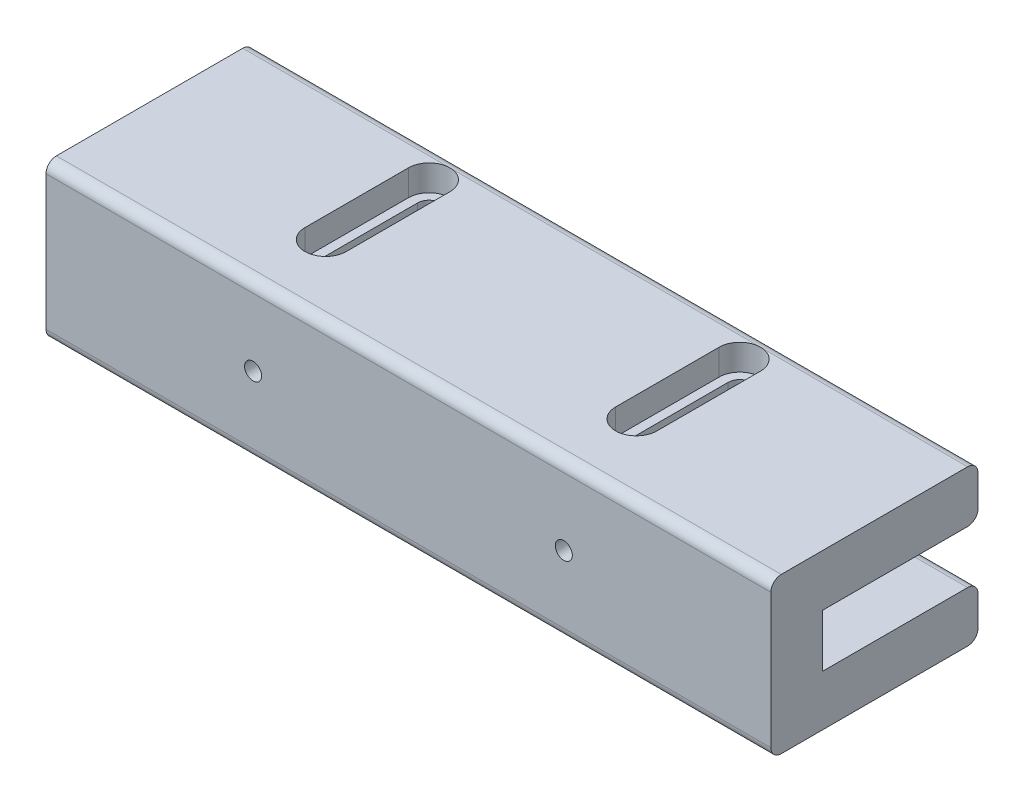
ISO-10303-21;
HEADER;
FILE_DESCRIPTION(('STEP AP214'),'2;1');
FILE_NAME('part.step','',(''),(''),'','','');
FILE_SCHEMA(('AUTOMOTIVE_DESIGN { 1 0 10303 214 1 1 1 1 }'));
ENDSEC;
DATA;
#1=APPLICATION_CONTEXT('core data for automotive mechanical design processes');
#2=APPLICATION_PROTOCOL_DEFINITION('international standard','automotive_design',2000,#1);
#3=PRODUCT_CONTEXT('',#1,'mechanical');
#4=PRODUCT('Part','Part','',(#3));
#5=PRODUCT_RELATED_PRODUCT_CATEGORY('part','',(#4));
#6=PRODUCT_DEFINITION_FORMATION('','',#4);
#7=PRODUCT_DEFINITION_CONTEXT('part definition',#1,'design');
#8=PRODUCT_DEFINITION('design','',#6,#7);
#9=PRODUCT_DEFINITION_SHAPE('','',#8);
#10=(LENGTH_UNIT() NAMED_UNIT(*) SI_UNIT(.MILLI.,.METRE.));
#11=(NAMED_UNIT(*) PLANE_ANGLE_UNIT() SI_UNIT($,.RADIAN.));
#12=(NAMED_UNIT(*) SI_UNIT($,.STERADIAN.) SOLID_ANGLE_UNIT());
#13=UNCERTAINTY_MEASURE_WITH_UNIT(LENGTH_MEASURE(1.E-05),#10,'distance_accuracy_value','');
#14=(GEOMETRIC_REPRESENTATION_CONTEXT(3) GLOBAL_UNCERTAINTY_ASSIGNED_CONTEXT((#13)) GLOBAL_UNIT_ASSIGNED_CONTEXT((#10,
#11,#12)) REPRESENTATION_CONTEXT('',''));
#15=CARTESIAN_POINT('',(0.,0.,0.));
#16=DIRECTION('',(0.,0.,1.));
#17=DIRECTION('',(1.,0.,0.));
#18=AXIS2_PLACEMENT_3D('',#15,#16,#17);
#19=CARTESIAN_POINT('',(27.75,-15.001,5.99999999999999));
#20=DIRECTION('',(-1.,0.,0.));
#21=DIRECTION('',(0.,0.,1.));
#22=AXIS2_PLACEMENT_3D('',#19,#20,#21);
#23=PLANE('',#22);
#24=DIRECTION('',(0.,0.,-1.));
#25=VECTOR('',#24,1.);
#26=CARTESIAN_POINT('',(27.75,10.,6.));
#27=LINE('',#26,#25);
#28=CARTESIAN_POINT('',(27.75,9.99999999999999,26.));
#29=VERTEX_POINT('',#28);
#30=CARTESIAN_POINT('',(27.75,9.99999999999999,6.));
#31=VERTEX_POINT('',#30);
#32=EDGE_CURVE('E68',#29,#31,#27,.T.);
#33=ORIENTED_EDGE('',*,*,#32,.F.);
#34=DIRECTION('',(0.,1.,0.));
#35=VECTOR('',#34,1.);
#36=CARTESIAN_POINT('',(27.75,-15.001,26.));
#37=LINE('',#36,#35);
#38=CARTESIAN_POINT('',(27.75,4.99999999999999,26.));
#39=VERTEX_POINT('',#38);
#40=EDGE_CURVE('E345',#39,#29,#37,.T.);
#41=ORIENTED_EDGE('',*,*,#40,.F.);
#42=DIRECTION('',(0.,0.,-1.));
#43=VECTOR('',#42,1.);
#44=CARTESIAN_POINT('',(27.75,5.,6.));
#45=LINE('',#44,#43);
#46=CARTESIAN_POINT('',(27.75,5.,5.99999999999999));
#47=VERTEX_POINT('',#46);
#48=EDGE_CURVE('E334',#39,#47,#45,.T.);
#49=ORIENTED_EDGE('',*,*,#48,.T.);
#50=DIRECTION('',(0.,1.,0.));
#51=VECTOR('',#50,1.);
#52=CARTESIAN_POINT('',(27.75,-15.001,5.99999999999999));
#53=LINE('',#52,#51);
#54=EDGE_CURVE('E349',#47,#31,#53,.T.);
#55=ORIENTED_EDGE('',*,*,#54,.T.);
#56=EDGE_LOOP('',(#33,#41,#49,#55));
#57=FACE_BOUND('',#56,.T.);
#58=ADVANCED_FACE('F46',(#57),#23,.F.);
#59=CARTESIAN_POINT('',(30.,-15.001,26.));
#60=DIRECTION('',(0.,1.,0.));
#61=DIRECTION('',(0.,0.,1.));
#62=AXIS2_PLACEMENT_3D('',#59,#60,#61);
#63=CYLINDRICAL_SURFACE('',#62,2.25);
#64=CARTESIAN_POINT('',(30.,9.99999999999999,26.));
#65=DIRECTION('',(0.,1.,0.));
#66=DIRECTION('',(0.,0.,1.));
#67=AXIS2_PLACEMENT_3D('',#64,#65,#66);
#68=CIRCLE('',#67,2.25);
#69=CARTESIAN_POINT('',(32.25,9.99999999999999,26.));
#70=VERTEX_POINT('',#69);
#71=EDGE_CURVE('E292',#70,#29,#68,.F.);
#72=ORIENTED_EDGE('',*,*,#71,.F.);
#73=DIRECTION('',(0.,1.,0.));
#74=VECTOR('',#73,1.);
#75=CARTESIAN_POINT('',(32.25,-15.001,26.));
#76=LINE('',#75,#74);
#77=CARTESIAN_POINT('',(32.25,4.99999999999999,26.));
#78=VERTEX_POINT('',#77);
#79=EDGE_CURVE('E350',#78,#70,#76,.T.);
#80=ORIENTED_EDGE('',*,*,#79,.F.);
#81=CARTESIAN_POINT('',(30.,5.,26.));
#82=DIRECTION('',(0.,1.,0.));
#83=DIRECTION('',(0.,0.,1.));
#84=AXIS2_PLACEMENT_3D('',#81,#82,#83);
#85=CIRCLE('',#84,2.25);
#86=EDGE_CURVE('E342',#78,#39,#85,.F.);
#87=ORIENTED_EDGE('',*,*,#86,.T.);
#88=ORIENTED_EDGE('',*,*,#40,.T.);
#89=EDGE_LOOP('',(#72,#80,#87,#88));
#90=FACE_BOUND('',#89,.T.);
#91=ADVANCED_FACE('F517',(#90),#63,.F.);
#92=CARTESIAN_POINT('',(32.25,-15.001,5.99999999999999));
#93=DIRECTION('',(1.,0.,0.));
#94=DIRECTION('',(0.,0.,-1.));
#95=AXIS2_PLACEMENT_3D('',#92,#93,#94);
#96=PLANE('',#95);
#97=DIRECTION('',(0.,0.,1.));
#98=VECTOR('',#97,1.);
#99=CARTESIAN_POINT('',(32.25,10.,6.));
#100=LINE('',#99,#98);
#101=CARTESIAN_POINT('',(32.25,10.,6.));
#102=VERTEX_POINT('',#101);
#103=EDGE_CURVE('E287',#102,#70,#100,.T.);
#104=ORIENTED_EDGE('',*,*,#103,.F.);
#105=DIRECTION('',(0.,1.,0.));
#106=VECTOR('',#105,1.);
#107=CARTESIAN_POINT('',(32.25,-15.001,5.99999999999999));
#108=LINE('',#107,#106);
#109=CARTESIAN_POINT('',(32.25,4.99999999999999,6.));
#110=VERTEX_POINT('',#109);
#111=EDGE_CURVE('E346',#110,#102,#108,.T.);
#112=ORIENTED_EDGE('',*,*,#111,.F.);
#113=DIRECTION('',(0.,0.,1.));
#114=VECTOR('',#113,1.);
#115=CARTESIAN_POINT('',(32.25,5.,6.));
#116=LINE('',#115,#114);
#117=EDGE_CURVE('E339',#110,#78,#116,.T.);
#118=ORIENTED_EDGE('',*,*,#117,.T.);
#119=ORIENTED_EDGE('',*,*,#79,.T.);
#120=EDGE_LOOP('',(#104,#112,#118,#119));
#121=FACE_BOUND('',#120,.T.);
#122=ADVANCED_FACE('F512',(#121),#96,.F.);
#123=CARTESIAN_POINT('',(30.,-15.001,5.99999999999999));
#124=DIRECTION('',(0.,1.,0.));
#125=DIRECTION('',(0.,0.,1.));
#126=AXIS2_PLACEMENT_3D('',#123,#124,#125);
#127=CYLINDRICAL_SURFACE('',#126,2.25);
#128=CARTESIAN_POINT('',(30.,10.,6.));
#129=DIRECTION('',(0.,1.,0.));
#130=DIRECTION('',(0.,0.,1.));
#131=AXIS2_PLACEMENT_3D('',#128,#129,#130);
#132=CIRCLE('',#131,2.25);
#133=EDGE_CURVE('E13',#31,#102,#132,.F.);
#134=ORIENTED_EDGE('',*,*,#133,.F.);
#135=ORIENTED_EDGE('',*,*,#54,.F.);
#136=CARTESIAN_POINT('',(30.,5.,6.));
#137=DIRECTION('',(0.,1.,0.));
#138=DIRECTION('',(0.,0.,1.));
#139=AXIS2_PLACEMENT_3D('',#136,#137,#138);
#140=CIRCLE('',#139,2.25);
#141=EDGE_CURVE('E336',#47,#110,#140,.F.);
#142=ORIENTED_EDGE('',*,*,#141,.T.);
#143=ORIENTED_EDGE('',*,*,#111,.T.);
#144=EDGE_LOOP('',(#134,#135,#142,#143));
#145=FACE_BOUND('',#144,.T.);
#146=ADVANCED_FACE('F505',(#145),#127,.F.);
#147=CARTESIAN_POINT('',(-32.25,-15.001,5.99999999999999));
#148=DIRECTION('',(-1.,0.,0.));
#149=DIRECTION('',(0.,0.,1.));
#150=AXIS2_PLACEMENT_3D('',#147,#148,#149);
#151=PLANE('',#150);
#152=DIRECTION('',(0.,0.,-1.));
#153=VECTOR('',#152,1.);
#154=CARTESIAN_POINT('',(-32.25,10.,6.));
#155=LINE('',#154,#153);
#156=CARTESIAN_POINT('',(-32.25,9.99999999999999,26.));
#157=VERTEX_POINT('',#156);
#158=CARTESIAN_POINT('',(-32.25,9.99999999999999,6.));
#159=VERTEX_POINT('',#158);
#160=EDGE_CURVE('E332',#157,#159,#155,.T.);
#161=ORIENTED_EDGE('',*,*,#160,.F.);
#162=DIRECTION('',(0.,1.,0.));
#163=VECTOR('',#162,1.);
#164=CARTESIAN_POINT('',(-32.25,-15.001,26.));
#165=LINE('',#164,#163);
#166=CARTESIAN_POINT('',(-32.25,4.99999999999999,26.));
#167=VERTEX_POINT('',#166);
#168=EDGE_CURVE('E368',#167,#157,#165,.T.);
#169=ORIENTED_EDGE('',*,*,#168,.F.);
#170=DIRECTION('',(0.,0.,-1.));
#171=VECTOR('',#170,1.);
#172=CARTESIAN_POINT('',(-32.25,5.,6.));
#173=LINE('',#172,#171);
#174=CARTESIAN_POINT('',(-32.25,5.,5.99999999999999));
#175=VERTEX_POINT('',#174);
#176=EDGE_CURVE('E357',#167,#175,#173,.T.);
#177=ORIENTED_EDGE('',*,*,#176,.T.);
#178=DIRECTION('',(0.,1.,0.));
#179=VECTOR('',#178,1.);
#180=CARTESIAN_POINT('',(-32.25,-15.001,5.99999999999999));
#181=LINE('',#180,#179);
#182=EDGE_CURVE('E372',#175,#159,#181,.T.);
#183=ORIENTED_EDGE('',*,*,#182,.T.);
#184=EDGE_LOOP('',(#161,#169,#177,#183));
#185=FACE_BOUND('',#184,.T.);
#186=ADVANCED_FACE('F503',(#185),#151,.F.);
#187=CARTESIAN_POINT('',(-30.,-15.001,26.));
#188=DIRECTION('',(0.,1.,0.));
#189=DIRECTION('',(0.,0.,1.));
#190=AXIS2_PLACEMENT_3D('',#187,#188,#189);
#191=CYLINDRICAL_SURFACE('',#190,2.25);
#192=CARTESIAN_POINT('',(-30.,9.99999999999999,26.));
#193=DIRECTION('',(0.,1.,0.));
#194=DIRECTION('',(0.,0.,1.));
#195=AXIS2_PLACEMENT_3D('',#192,#193,#194);
#196=CIRCLE('',#195,2.25);
#197=CARTESIAN_POINT('',(-27.75,9.99999999999999,26.));
#198=VERTEX_POINT('',#197);
#199=EDGE_CURVE('E330',#198,#157,#196,.F.);
#200=ORIENTED_EDGE('',*,*,#199,.F.);
#201=DIRECTION('',(0.,1.,0.));
#202=VECTOR('',#201,1.);
#203=CARTESIAN_POINT('',(-27.75,-15.001,26.));
#204=LINE('',#203,#202);
#205=CARTESIAN_POINT('',(-27.75,4.99999999999999,26.));
#206=VERTEX_POINT('',#205);
#207=EDGE_CURVE('E373',#206,#198,#204,.T.);
#208=ORIENTED_EDGE('',*,*,#207,.F.);
#209=CARTESIAN_POINT('',(-30.,5.,26.));
#210=DIRECTION('',(0.,1.,0.));
#211=DIRECTION('',(0.,0.,1.));
#212=AXIS2_PLACEMENT_3D('',#209,#210,#211);
#213=CIRCLE('',#212,2.25);
#214=EDGE_CURVE('E365',#206,#167,#213,.F.);
#215=ORIENTED_EDGE('',*,*,#214,.T.);
#216=ORIENTED_EDGE('',*,*,#168,.T.);
#217=EDGE_LOOP('',(#200,#208,#215,#216));
#218=FACE_BOUND('',#217,.T.);
#219=ADVANCED_FACE('F501',(#218),#191,.F.);
#220=CARTESIAN_POINT('',(-27.75,-15.001,5.99999999999999));
#221=DIRECTION('',(1.,0.,0.));
#222=DIRECTION('',(0.,0.,-1.));
#223=AXIS2_PLACEMENT_3D('',#220,#221,#222);
#224=PLANE('',#223);
#225=DIRECTION('',(0.,0.,1.));
#226=VECTOR('',#225,1.);
#227=CARTESIAN_POINT('',(-27.75,10.,6.));
#228=LINE('',#227,#226);
#229=CARTESIAN_POINT('',(-27.75,10.,6.));
#230=VERTEX_POINT('',#229);
#231=EDGE_CURVE('E323',#230,#198,#228,.T.);
#232=ORIENTED_EDGE('',*,*,#231,.F.);
#233=DIRECTION('',(0.,1.,0.));
#234=VECTOR('',#233,1.);
#235=CARTESIAN_POINT('',(-27.75,-15.001,5.99999999999999));
#236=LINE('',#235,#234);
#237=CARTESIAN_POINT('',(-27.75,4.99999999999999,6.));
#238=VERTEX_POINT('',#237);
#239=EDGE_CURVE('E369',#238,#230,#236,.T.);
#240=ORIENTED_EDGE('',*,*,#239,.F.);
#241=DIRECTION('',(0.,0.,1.));
#242=VECTOR('',#241,1.);
#243=CARTESIAN_POINT('',(-27.75,5.,6.));
#244=LINE('',#243,#242);
#245=EDGE_CURVE('E362',#238,#206,#244,.T.);
#246=ORIENTED_EDGE('',*,*,#245,.T.);
#247=ORIENTED_EDGE('',*,*,#207,.T.);
#248=EDGE_LOOP('',(#232,#240,#246,#247));
#249=FACE_BOUND('',#248,.T.);
#250=ADVANCED_FACE('F491',(#249),#224,.F.);
#251=CARTESIAN_POINT('',(-30.,-15.001,5.99999999999999));
#252=DIRECTION('',(0.,1.,0.));
#253=DIRECTION('',(0.,0.,1.));
#254=AXIS2_PLACEMENT_3D('',#251,#252,#253);
#255=CYLINDRICAL_SURFACE('',#254,2.25);
#256=CARTESIAN_POINT('',(-30.,10.,6.));
#257=DIRECTION('',(0.,1.,0.));
#258=DIRECTION('',(0.,0.,1.));
#259=AXIS2_PLACEMENT_3D('',#256,#257,#258);
#260=CIRCLE('',#259,2.25);
#261=EDGE_CURVE('E54',#159,#230,#260,.F.);
#262=ORIENTED_EDGE('',*,*,#261,.F.);
#263=ORIENTED_EDGE('',*,*,#182,.F.);
#264=CARTESIAN_POINT('',(-30.,5.,6.));
#265=DIRECTION('',(0.,1.,0.));
#266=DIRECTION('',(0.,0.,1.));
#267=AXIS2_PLACEMENT_3D('',#264,#265,#266);
#268=CIRCLE('',#267,2.25);
#269=EDGE_CURVE('E359',#175,#238,#268,.F.);
#270=ORIENTED_EDGE('',*,*,#269,.T.);
#271=ORIENTED_EDGE('',*,*,#239,.T.);
#272=EDGE_LOOP('',(#262,#263,#270,#271));
#273=FACE_BOUND('',#272,.T.);
#274=ADVANCED_FACE('F492',(#273),#255,.F.);
#275=CARTESIAN_POINT('',(70.,-15.,0.));
#276=DIRECTION('',(0.,0.,1.));
#277=DIRECTION('',(1.,0.,0.));
#278=AXIS2_PLACEMENT_3D('',#275,#276,#277);
#279=PLANE('',#278);
#280=DIRECTION('',(0.,1.,0.));
#281=VECTOR('',#280,1.);
#282=CARTESIAN_POINT('',(70.,-15.,0.));
#283=LINE('',#282,#281);
#284=CARTESIAN_POINT('',(70.,-13.,0.));
#285=VERTEX_POINT('',#284);
#286=CARTESIAN_POINT('',(70.,-7.2,0.));
#287=VERTEX_POINT('',#286);
#288=EDGE_CURVE('E397',#285,#287,#283,.T.);
#289=ORIENTED_EDGE('',*,*,#288,.F.);
#290=DIRECTION('',(-1.,0.,0.));
#291=VECTOR('',#290,1.);
#292=CARTESIAN_POINT('',(70.,-13.,0.));
#293=LINE('',#292,#291);
#294=CARTESIAN_POINT('',(-70.,-13.,0.));
#295=VERTEX_POINT('',#294);
#296=EDGE_CURVE('E430',#285,#295,#293,.T.);
#297=ORIENTED_EDGE('',*,*,#296,.T.);
#298=DIRECTION('',(0.,1.,0.));
#299=VECTOR('',#298,1.);
#300=CARTESIAN_POINT('',(-70.,-15.,0.));
#301=LINE('',#300,#299);
#302=CARTESIAN_POINT('',(-70.,-7.2,0.));
#303=VERTEX_POINT('',#302);
#304=EDGE_CURVE('E411',#295,#303,#301,.T.);
#305=ORIENTED_EDGE('',*,*,#304,.T.);
#306=DIRECTION('',(1.,0.,0.));
#307=VECTOR('',#306,1.);
#308=CARTESIAN_POINT('',(70.,-7.2,0.));
#309=LINE('',#308,#307);
#310=EDGE_CURVE('E427',#303,#287,#309,.T.);
#311=ORIENTED_EDGE('',*,*,#310,.T.);
#312=EDGE_LOOP('',(#289,#297,#305,#311));
#313=FACE_BOUND('',#312,.T.);
#314=ADVANCED_FACE('F529',(#313),#279,.F.);
#315=CARTESIAN_POINT('',(70.,7.,0.));
#316=VERTEX_POINT('',#315);
#317=CARTESIAN_POINT('',(70.,13.,0.));
#318=VERTEX_POINT('',#317);
#319=EDGE_CURVE('E394',#316,#318,#283,.T.);
#320=ORIENTED_EDGE('',*,*,#319,.F.);
#321=DIRECTION('',(1.,0.,0.));
#322=VECTOR('',#321,1.);
#323=CARTESIAN_POINT('',(70.,7.,0.));
#324=LINE('',#323,#322);
#325=CARTESIAN_POINT('',(-70.,7.,0.));
#326=VERTEX_POINT('',#325);
#327=EDGE_CURVE('E469',#316,#326,#324,.F.);
#328=ORIENTED_EDGE('',*,*,#327,.T.);
#329=CARTESIAN_POINT('',(-70.,13.,0.));
#330=VERTEX_POINT('',#329);
#331=EDGE_CURVE('E393',#326,#330,#301,.T.);
#332=ORIENTED_EDGE('',*,*,#331,.T.);
#333=DIRECTION('',(-1.,0.,0.));
#334=VECTOR('',#333,1.);
#335=CARTESIAN_POINT('',(70.,13.,0.));
#336=LINE('',#335,#334);
#337=EDGE_CURVE('E467',#330,#318,#336,.F.);
#338=ORIENTED_EDGE('',*,*,#337,.T.);
#339=EDGE_LOOP('',(#320,#328,#332,#338));
#340=FACE_BOUND('',#339,.T.);
#341=ADVANCED_FACE('F546',(#340),#279,.F.);
#342=CARTESIAN_POINT('',(70.,15.,0.));
#343=DIRECTION('',(0.,-1.,0.));
#344=DIRECTION('',(0.,0.,-1.));
#345=AXIS2_PLACEMENT_3D('',#342,#343,#344);
#346=PLANE('',#345);
#347=DIRECTION('',(-1.,0.,0.));
#348=VECTOR('',#347,1.);
#349=CARTESIAN_POINT('',(70.,15.,2.));
#350=LINE('',#349,#348);
#351=CARTESIAN_POINT('',(70.,15.,2.));
#352=VERTEX_POINT('',#351);
#353=CARTESIAN_POINT('',(30.,15.,2.));
#354=VERTEX_POINT('',#353);
#355=EDGE_CURVE('E474',#352,#354,#350,.T.);
#356=ORIENTED_EDGE('',*,*,#355,.T.);
#357=CARTESIAN_POINT('',(30.,15.,6.));
#358=DIRECTION('',(0.,1.,0.));
#359=DIRECTION('',(0.,0.,1.));
#360=AXIS2_PLACEMENT_3D('',#357,#358,#359);
#361=CIRCLE('',#360,4.);
#362=CARTESIAN_POINT('',(34.,15.,6.));
#363=VERTEX_POINT('',#362);
#364=EDGE_CURVE('E279',#363,#354,#361,.T.);
#365=ORIENTED_EDGE('',*,*,#364,.F.);
#366=DIRECTION('',(0.,0.,-1.));
#367=VECTOR('',#366,1.);
#368=CARTESIAN_POINT('',(34.,15.,6.));
#369=LINE('',#368,#367);
#370=CARTESIAN_POINT('',(34.,15.,26.));
#371=VERTEX_POINT('',#370);
#372=EDGE_CURVE('E268',#371,#363,#369,.T.);
#373=ORIENTED_EDGE('',*,*,#372,.F.);
#374=CARTESIAN_POINT('',(30.,15.,26.));
#375=DIRECTION('',(0.,1.,0.));
#376=DIRECTION('',(0.,0.,1.));
#377=AXIS2_PLACEMENT_3D('',#374,#375,#376);
#378=CIRCLE('',#377,4.);
#379=CARTESIAN_POINT('',(26.,15.,26.));
#380=VERTEX_POINT('',#379);
#381=EDGE_CURVE('E271',#380,#371,#378,.T.);
#382=ORIENTED_EDGE('',*,*,#381,.F.);
#383=DIRECTION('',(0.,0.,1.));
#384=VECTOR('',#383,1.);
#385=CARTESIAN_POINT('',(26.,15.,6.));
#386=LINE('',#385,#384);
#387=CARTESIAN_POINT('',(26.,15.,6.));
#388=VERTEX_POINT('',#387);
#389=EDGE_CURVE('E281',#388,#380,#386,.T.);
#390=ORIENTED_EDGE('',*,*,#389,.F.);
#391=EDGE_CURVE('E253',#354,#388,#361,.T.);
#392=ORIENTED_EDGE('',*,*,#391,.F.);
#393=CARTESIAN_POINT('',(-30.,15.,2.));
#394=VERTEX_POINT('',#393);
#395=EDGE_CURVE('E478',#354,#394,#350,.T.);
#396=ORIENTED_EDGE('',*,*,#395,.T.);
#397=CARTESIAN_POINT('',(-30.,15.,6.));
#398=DIRECTION('',(0.,1.,0.));
#399=DIRECTION('',(0.,0.,1.));
#400=AXIS2_PLACEMENT_3D('',#397,#398,#399);
#401=CIRCLE('',#400,3.99999999999999);
#402=CARTESIAN_POINT('',(-26.,15.,6.));
#403=VERTEX_POINT('',#402);
#404=EDGE_CURVE('E310',#403,#394,#401,.T.);
#405=ORIENTED_EDGE('',*,*,#404,.F.);
#406=DIRECTION('',(0.,0.,-1.));
#407=VECTOR('',#406,1.);
#408=CARTESIAN_POINT('',(-26.,15.,6.));
#409=LINE('',#408,#407);
#410=CARTESIAN_POINT('',(-26.,15.,26.));
#411=VERTEX_POINT('',#410);
#412=EDGE_CURVE('E300',#411,#403,#409,.T.);
#413=ORIENTED_EDGE('',*,*,#412,.F.);
#414=CARTESIAN_POINT('',(-30.,15.,26.));
#415=DIRECTION('',(0.,1.,0.));
#416=DIRECTION('',(0.,0.,1.));
#417=AXIS2_PLACEMENT_3D('',#414,#415,#416);
#418=CIRCLE('',#417,4.);
#419=CARTESIAN_POINT('',(-34.,15.,26.));
#420=VERTEX_POINT('',#419);
#421=EDGE_CURVE('E316',#420,#411,#418,.T.);
#422=ORIENTED_EDGE('',*,*,#421,.F.);
#423=DIRECTION('',(0.,0.,1.));
#424=VECTOR('',#423,1.);
#425=CARTESIAN_POINT('',(-34.,15.,5.99999999999999));
#426=LINE('',#425,#424);
#427=CARTESIAN_POINT('',(-34.,15.,5.99999999999999));
#428=VERTEX_POINT('',#427);
#429=EDGE_CURVE('E313',#428,#420,#426,.T.);
#430=ORIENTED_EDGE('',*,*,#429,.F.);
#431=EDGE_CURVE('E295',#394,#428,#401,.T.);
#432=ORIENTED_EDGE('',*,*,#431,.F.);
#433=CARTESIAN_POINT('',(-70.,15.,2.));
#434=VERTEX_POINT('',#433);
#435=EDGE_CURVE('E473',#394,#434,#350,.T.);
#436=ORIENTED_EDGE('',*,*,#435,.T.);
#437=DIRECTION('',(0.,0.,1.));
#438=VECTOR('',#437,1.);
#439=CARTESIAN_POINT('',(-70.,15.,0.));
#440=LINE('',#439,#438);
#441=CARTESIAN_POINT('',(-70.,15.,38.));
#442=VERTEX_POINT('',#441);
#443=EDGE_CURVE('E412',#434,#442,#440,.T.);
#444=ORIENTED_EDGE('',*,*,#443,.T.);
#445=DIRECTION('',(-1.,0.,0.));
#446=VECTOR('',#445,1.);
#447=CARTESIAN_POINT('',(70.,15.,38.));
#448=LINE('',#447,#446);
#449=CARTESIAN_POINT('',(70.,15.,38.));
#450=VERTEX_POINT('',#449);
#451=EDGE_CURVE('E471',#442,#450,#448,.F.);
#452=ORIENTED_EDGE('',*,*,#451,.T.);
#453=DIRECTION('',(0.,0.,1.));
#454=VECTOR('',#453,1.);
#455=CARTESIAN_POINT('',(70.,15.,0.));
#456=LINE('',#455,#454);
#457=EDGE_CURVE('E399',#352,#450,#456,.T.);
#458=ORIENTED_EDGE('',*,*,#457,.F.);
#459=EDGE_LOOP('',(#356,#365,#373,#382,#390,#392,#396,#405,#413,#422,#430,#432,#436,#444,#452,#458));
#460=FACE_BOUND('',#459,.T.);
#461=ADVANCED_FACE('F554',(#460),#346,.F.);
#462=CARTESIAN_POINT('',(70.,-15.,40.));
#463=DIRECTION('',(0.,0.,-1.));
#464=DIRECTION('',(-1.,0.,0.));
#465=AXIS2_PLACEMENT_3D('',#462,#463,#464);
#466=PLANE('',#465);
#467=CARTESIAN_POINT('',(-30.,0.,40.));
#468=DIRECTION('',(0.,0.,1.));
#469=DIRECTION('',(1.,0.,0.));
#470=AXIS2_PLACEMENT_3D('',#467,#468,#469);
#471=CIRCLE('',#470,1.64999999999999);
#472=CARTESIAN_POINT('',(-28.35,0.,40.));
#473=VERTEX_POINT('',#472);
#474=EDGE_CURVE('E846',#473,#473,#471,.T.);
#475=ORIENTED_EDGE('',*,*,#474,.F.);
#476=EDGE_LOOP('',(#475));
#477=FACE_BOUND('',#476,.T.);
#478=CARTESIAN_POINT('',(30.,0.,40.));
#479=DIRECTION('',(0.,0.,1.));
#480=DIRECTION('',(1.,0.,0.));
#481=AXIS2_PLACEMENT_3D('',#478,#479,#480);
#482=CIRCLE('',#481,1.64999999999998);
#483=CARTESIAN_POINT('',(31.65,0.,40.));
#484=VERTEX_POINT('',#483);
#485=EDGE_CURVE('E848',#484,#484,#482,.T.);
#486=ORIENTED_EDGE('',*,*,#485,.F.);
#487=EDGE_LOOP('',(#486));
#488=FACE_BOUND('',#487,.T.);
#489=DIRECTION('',(0.,-1.,0.));
#490=VECTOR('',#489,1.);
#491=CARTESIAN_POINT('',(-70.,-15.,40.));
#492=LINE('',#491,#490);
#493=CARTESIAN_POINT('',(-70.,13.,40.));
#494=VERTEX_POINT('',#493);
#495=CARTESIAN_POINT('',(-70.,-13.,40.));
#496=VERTEX_POINT('',#495);
#497=EDGE_CURVE('E415',#494,#496,#492,.T.);
#498=ORIENTED_EDGE('',*,*,#497,.T.);
#499=DIRECTION('',(-1.,0.,0.));
#500=VECTOR('',#499,1.);
#501=CARTESIAN_POINT('',(70.,-13.,40.));
#502=LINE('',#501,#500);
#503=CARTESIAN_POINT('',(70.,-13.,40.));
#504=VERTEX_POINT('',#503);
#505=EDGE_CURVE('E481',#496,#504,#502,.F.);
#506=ORIENTED_EDGE('',*,*,#505,.T.);
#507=DIRECTION('',(0.,-1.,0.));
#508=VECTOR('',#507,1.);
#509=CARTESIAN_POINT('',(70.,-15.,40.));
#510=LINE('',#509,#508);
#511=CARTESIAN_POINT('',(70.,13.,40.));
#512=VERTEX_POINT('',#511);
#513=EDGE_CURVE('E402',#512,#504,#510,.T.);
#514=ORIENTED_EDGE('',*,*,#513,.F.);
#515=DIRECTION('',(-1.,0.,0.));
#516=VECTOR('',#515,1.);
#517=CARTESIAN_POINT('',(70.,13.,40.));
#518=LINE('',#517,#516);
#519=EDGE_CURVE('E477',#512,#494,#518,.T.);
#520=ORIENTED_EDGE('',*,*,#519,.T.);
#521=EDGE_LOOP('',(#498,#506,#514,#520));
#522=FACE_BOUND('',#521,.T.);
#523=ADVANCED_FACE('F561',(#477,#488,#522),#466,.F.);
#524=CARTESIAN_POINT('',(70.,-15.,0.));
#525=DIRECTION('',(0.,1.,0.));
#526=DIRECTION('',(0.,0.,1.));
#527=AXIS2_PLACEMENT_3D('',#524,#525,#526);
#528=PLANE('',#527);
#529=DIRECTION('',(0.,0.,-1.));
#530=VECTOR('',#529,1.);
#531=CARTESIAN_POINT('',(-70.,-15.,0.));
#532=LINE('',#531,#530);
#533=CARTESIAN_POINT('',(-70.,-15.,38.));
#534=VERTEX_POINT('',#533);
#535=CARTESIAN_POINT('',(-70.,-15.,2.));
#536=VERTEX_POINT('',#535);
#537=EDGE_CURVE('E398',#534,#536,#532,.T.);
#538=ORIENTED_EDGE('',*,*,#537,.T.);
#539=DIRECTION('',(-1.,0.,0.));
#540=VECTOR('',#539,1.);
#541=CARTESIAN_POINT('',(70.,-15.,2.));
#542=LINE('',#541,#540);
#543=CARTESIAN_POINT('',(70.,-15.,2.));
#544=VERTEX_POINT('',#543);
#545=EDGE_CURVE('E448',#536,#544,#542,.F.);
#546=ORIENTED_EDGE('',*,*,#545,.T.);
#547=DIRECTION('',(0.,0.,-1.));
#548=VECTOR('',#547,1.);
#549=CARTESIAN_POINT('',(70.,-15.,0.));
#550=LINE('',#549,#548);
#551=CARTESIAN_POINT('',(70.,-15.,38.));
#552=VERTEX_POINT('',#551);
#553=EDGE_CURVE('E405',#552,#544,#550,.T.);
#554=ORIENTED_EDGE('',*,*,#553,.F.);
#555=DIRECTION('',(-1.,0.,0.));
#556=VECTOR('',#555,1.);
#557=CARTESIAN_POINT('',(70.,-15.,38.));
#558=LINE('',#557,#556);
#559=EDGE_CURVE('E445',#552,#534,#558,.T.);
#560=ORIENTED_EDGE('',*,*,#559,.T.);
#561=EDGE_LOOP('',(#538,#546,#554,#560));
#562=FACE_BOUND('',#561,.T.);
#563=ADVANCED_FACE('F571',(#562),#528,.F.);
#564=CARTESIAN_POINT('',(70.,0.,0.));
#565=DIRECTION('',(1.,0.,0.));
#566=DIRECTION('',(0.,0.,-1.));
#567=AXIS2_PLACEMENT_3D('',#564,#565,#566);
#568=PLANE('',#567);
#569=ORIENTED_EDGE('',*,*,#553,.T.);
#570=CARTESIAN_POINT('',(70.,-13.,2.));
#571=DIRECTION('',(1.,0.,0.));
#572=DIRECTION('',(0.,0.,-1.));
#573=AXIS2_PLACEMENT_3D('',#570,#571,#572);
#574=CIRCLE('',#573,2.);
#575=EDGE_CURVE('E460',#544,#285,#574,.T.);
#576=ORIENTED_EDGE('',*,*,#575,.T.);
#577=ORIENTED_EDGE('',*,*,#288,.T.);
#578=CARTESIAN_POINT('',(70.,-7.2,2.));
#579=DIRECTION('',(1.,0.,0.));
#580=DIRECTION('',(0.,0.,-1.));
#581=AXIS2_PLACEMENT_3D('',#578,#579,#580);
#582=CIRCLE('',#581,2.);
#583=CARTESIAN_POINT('',(70.,-5.2,2.));
#584=VERTEX_POINT('',#583);
#585=EDGE_CURVE('E458',#287,#584,#582,.T.);
#586=ORIENTED_EDGE('',*,*,#585,.T.);
#587=DIRECTION('',(0.,0.,-1.));
#588=VECTOR('',#587,1.);
#589=CARTESIAN_POINT('',(70.,-5.2,0.));
#590=LINE('',#589,#588);
#591=CARTESIAN_POINT('',(70.,-5.2,30.));
#592=VERTEX_POINT('',#591);
#593=EDGE_CURVE('E390',#592,#584,#590,.T.);
#594=ORIENTED_EDGE('',*,*,#593,.F.);
#595=DIRECTION('',(0.,-1.,0.));
#596=VECTOR('',#595,1.);
#597=CARTESIAN_POINT('',(70.,0.,30.));
#598=LINE('',#597,#596);
#599=CARTESIAN_POINT('',(70.,5.,30.));
#600=VERTEX_POINT('',#599);
#601=EDGE_CURVE('E388',#600,#592,#598,.T.);
#602=ORIENTED_EDGE('',*,*,#601,.F.);
#603=DIRECTION('',(0.,0.,1.));
#604=VECTOR('',#603,1.);
#605=CARTESIAN_POINT('',(70.,5.,0.));
#606=LINE('',#605,#604);
#607=CARTESIAN_POINT('',(70.,5.,2.));
#608=VERTEX_POINT('',#607);
#609=EDGE_CURVE('E384',#608,#600,#606,.T.);
#610=ORIENTED_EDGE('',*,*,#609,.F.);
#611=CARTESIAN_POINT('',(70.,7.,2.));
#612=DIRECTION('',(1.,0.,0.));
#613=DIRECTION('',(0.,0.,-1.));
#614=AXIS2_PLACEMENT_3D('',#611,#612,#613);
#615=CIRCLE('',#614,2.);
#616=EDGE_CURVE('E456',#608,#316,#615,.T.);
#617=ORIENTED_EDGE('',*,*,#616,.T.);
#618=ORIENTED_EDGE('',*,*,#319,.T.);
#619=CARTESIAN_POINT('',(70.,13.,2.));
#620=DIRECTION('',(1.,0.,0.));
#621=DIRECTION('',(0.,0.,-1.));
#622=AXIS2_PLACEMENT_3D('',#619,#620,#621);
#623=CIRCLE('',#622,2.);
#624=EDGE_CURVE('E454',#318,#352,#623,.T.);
#625=ORIENTED_EDGE('',*,*,#624,.T.);
#626=ORIENTED_EDGE('',*,*,#457,.T.);
#627=CARTESIAN_POINT('',(70.,13.,38.));
#628=DIRECTION('',(1.,0.,0.));
#629=DIRECTION('',(0.,0.,-1.));
#630=AXIS2_PLACEMENT_3D('',#627,#628,#629);
#631=CIRCLE('',#630,2.);
#632=EDGE_CURVE('E450',#450,#512,#631,.T.);
#633=ORIENTED_EDGE('',*,*,#632,.T.);
#634=ORIENTED_EDGE('',*,*,#513,.T.);
#635=CARTESIAN_POINT('',(70.,-13.,38.));
#636=DIRECTION('',(1.,0.,0.));
#637=DIRECTION('',(0.,0.,-1.));
#638=AXIS2_PLACEMENT_3D('',#635,#636,#637);
#639=CIRCLE('',#638,2.);
#640=EDGE_CURVE('E452',#504,#552,#639,.T.);
#641=ORIENTED_EDGE('',*,*,#640,.T.);
#642=EDGE_LOOP('',(#569,#576,#577,#586,#594,#602,#610,#617,#618,#625,#626,#633,#634,#641));
#643=FACE_BOUND('',#642,.T.);
#644=ADVANCED_FACE('F582',(#643),#568,.T.);
#645=CARTESIAN_POINT('',(-70.,0.,0.));
#646=DIRECTION('',(1.,0.,0.));
#647=DIRECTION('',(0.,0.,-1.));
#648=AXIS2_PLACEMENT_3D('',#645,#646,#647);
#649=PLANE('',#648);
#650=ORIENTED_EDGE('',*,*,#304,.F.);
#651=CARTESIAN_POINT('',(-70.,-13.,2.));
#652=DIRECTION('',(1.,0.,0.));
#653=DIRECTION('',(0.,0.,-1.));
#654=AXIS2_PLACEMENT_3D('',#651,#652,#653);
#655=CIRCLE('',#654,2.);
#656=EDGE_CURVE('E443',#295,#536,#655,.F.);
#657=ORIENTED_EDGE('',*,*,#656,.T.);
#658=ORIENTED_EDGE('',*,*,#537,.F.);
#659=CARTESIAN_POINT('',(-70.,-13.,38.));
#660=DIRECTION('',(1.,0.,0.));
#661=DIRECTION('',(0.,0.,-1.));
#662=AXIS2_PLACEMENT_3D('',#659,#660,#661);
#663=CIRCLE('',#662,2.);
#664=EDGE_CURVE('E435',#534,#496,#663,.F.);
#665=ORIENTED_EDGE('',*,*,#664,.T.);
#666=ORIENTED_EDGE('',*,*,#497,.F.);
#667=CARTESIAN_POINT('',(-70.,13.,38.));
#668=DIRECTION('',(1.,0.,0.));
#669=DIRECTION('',(0.,0.,-1.));
#670=AXIS2_PLACEMENT_3D('',#667,#668,#669);
#671=CIRCLE('',#670,2.);
#672=EDGE_CURVE('E433',#494,#442,#671,.F.);
#673=ORIENTED_EDGE('',*,*,#672,.T.);
#674=ORIENTED_EDGE('',*,*,#443,.F.);
#675=CARTESIAN_POINT('',(-70.,13.,2.));
#676=DIRECTION('',(1.,0.,0.));
#677=DIRECTION('',(0.,0.,-1.));
#678=AXIS2_PLACEMENT_3D('',#675,#676,#677);
#679=CIRCLE('',#678,2.);
#680=EDGE_CURVE('E437',#434,#330,#679,.F.);
#681=ORIENTED_EDGE('',*,*,#680,.T.);
#682=ORIENTED_EDGE('',*,*,#331,.F.);
#683=CARTESIAN_POINT('',(-70.,7.,2.));
#684=DIRECTION('',(1.,0.,0.));
#685=DIRECTION('',(0.,0.,-1.));
#686=AXIS2_PLACEMENT_3D('',#683,#684,#685);
#687=CIRCLE('',#686,2.);
#688=CARTESIAN_POINT('',(-70.,5.,2.));
#689=VERTEX_POINT('',#688);
#690=EDGE_CURVE('E439',#326,#689,#687,.F.);
#691=ORIENTED_EDGE('',*,*,#690,.T.);
#692=DIRECTION('',(0.,0.,1.));
#693=VECTOR('',#692,1.);
#694=CARTESIAN_POINT('',(-70.,5.,0.));
#695=LINE('',#694,#693);
#696=CARTESIAN_POINT('',(-70.,5.,30.));
#697=VERTEX_POINT('',#696);
#698=EDGE_CURVE('E408',#689,#697,#695,.T.);
#699=ORIENTED_EDGE('',*,*,#698,.T.);
#700=DIRECTION('',(0.,-1.,0.));
#701=VECTOR('',#700,1.);
#702=CARTESIAN_POINT('',(-70.,0.,30.));
#703=LINE('',#702,#701);
#704=CARTESIAN_POINT('',(-70.,-5.2,30.));
#705=VERTEX_POINT('',#704);
#706=EDGE_CURVE('E421',#697,#705,#703,.T.);
#707=ORIENTED_EDGE('',*,*,#706,.T.);
#708=DIRECTION('',(0.,0.,-1.));
#709=VECTOR('',#708,1.);
#710=CARTESIAN_POINT('',(-70.,-5.2,0.));
#711=LINE('',#710,#709);
#712=CARTESIAN_POINT('',(-70.,-5.2,2.));
#713=VERTEX_POINT('',#712);
#714=EDGE_CURVE('E424',#705,#713,#711,.T.);
#715=ORIENTED_EDGE('',*,*,#714,.T.);
#716=CARTESIAN_POINT('',(-70.,-7.2,2.));
#717=DIRECTION('',(1.,0.,0.));
#718=DIRECTION('',(0.,0.,-1.));
#719=AXIS2_PLACEMENT_3D('',#716,#717,#718);
#720=CIRCLE('',#719,2.);
#721=EDGE_CURVE('E441',#713,#303,#720,.F.);
#722=ORIENTED_EDGE('',*,*,#721,.T.);
#723=EDGE_LOOP('',(#650,#657,#658,#665,#666,#673,#674,#681,#682,#691,#699,#707,#715,#722));
#724=FACE_BOUND('',#723,.T.);
#725=ADVANCED_FACE('F589',(#724),#649,.F.);
#726=CARTESIAN_POINT('',(-100.,-5.2,0.));
#727=DIRECTION('',(0.,-1.,0.));
#728=DIRECTION('',(0.,0.,-1.));
#729=AXIS2_PLACEMENT_3D('',#726,#727,#728);
#730=PLANE('',#729);
#731=ORIENTED_EDGE('',*,*,#593,.T.);
#732=DIRECTION('',(1.,0.,0.));
#733=VECTOR('',#732,1.);
#734=CARTESIAN_POINT('',(-100.,-5.2,2.));
#735=LINE('',#734,#733);
#736=EDGE_CURVE('E462',#584,#713,#735,.F.);
#737=ORIENTED_EDGE('',*,*,#736,.T.);
#738=ORIENTED_EDGE('',*,*,#714,.F.);
#739=DIRECTION('',(1.,0.,0.));
#740=VECTOR('',#739,1.);
#741=CARTESIAN_POINT('',(-100.,-5.2,30.));
#742=LINE('',#741,#740);
#743=EDGE_CURVE('E381',#705,#592,#742,.T.);
#744=ORIENTED_EDGE('',*,*,#743,.T.);
#745=EDGE_LOOP('',(#731,#737,#738,#744));
#746=FACE_BOUND('',#745,.T.);
#747=ADVANCED_FACE('F597',(#746),#730,.F.);
#748=CARTESIAN_POINT('',(-100.,5.,30.));
#749=DIRECTION('',(0.,0.,1.));
#750=DIRECTION('',(1.,0.,0.));
#751=AXIS2_PLACEMENT_3D('',#748,#749,#750);
#752=PLANE('',#751);
#753=CARTESIAN_POINT('',(-30.,0.,30.));
#754=DIRECTION('',(0.,0.,1.));
#755=DIRECTION('',(1.,0.,0.));
#756=AXIS2_PLACEMENT_3D('',#753,#754,#755);
#757=CIRCLE('',#756,1.64999999999999);
#758=CARTESIAN_POINT('',(-28.35,0.,30.));
#759=VERTEX_POINT('',#758);
#760=EDGE_CURVE('E843',#759,#759,#757,.T.);
#761=ORIENTED_EDGE('',*,*,#760,.T.);
#762=EDGE_LOOP('',(#761));
#763=FACE_BOUND('',#762,.T.);
#764=CARTESIAN_POINT('',(30.,0.,30.));
#765=DIRECTION('',(0.,0.,1.));
#766=DIRECTION('',(1.,0.,0.));
#767=AXIS2_PLACEMENT_3D('',#764,#765,#766);
#768=CIRCLE('',#767,1.64999999999999);
#769=CARTESIAN_POINT('',(31.65,0.,30.));
#770=VERTEX_POINT('',#769);
#771=EDGE_CURVE('E274',#770,#770,#768,.T.);
#772=ORIENTED_EDGE('',*,*,#771,.T.);
#773=EDGE_LOOP('',(#772));
#774=FACE_BOUND('',#773,.T.);
#775=ORIENTED_EDGE('',*,*,#601,.T.);
#776=ORIENTED_EDGE('',*,*,#743,.F.);
#777=ORIENTED_EDGE('',*,*,#706,.F.);
#778=DIRECTION('',(1.,0.,0.));
#779=VECTOR('',#778,1.);
#780=CARTESIAN_POINT('',(-100.,5.,30.));
#781=LINE('',#780,#779);
#782=EDGE_CURVE('E380',#697,#600,#781,.T.);
#783=ORIENTED_EDGE('',*,*,#782,.T.);
#784=EDGE_LOOP('',(#775,#776,#777,#783));
#785=FACE_BOUND('',#784,.T.);
#786=ADVANCED_FACE('F605',(#763,#774,#785),#752,.F.);
#787=CARTESIAN_POINT('',(-100.,5.,0.));
#788=DIRECTION('',(0.,1.,0.));
#789=DIRECTION('',(0.,0.,1.));
#790=AXIS2_PLACEMENT_3D('',#787,#788,#789);
#791=PLANE('',#790);
#792=ORIENTED_EDGE('',*,*,#141,.F.);
#793=ORIENTED_EDGE('',*,*,#48,.F.);
#794=ORIENTED_EDGE('',*,*,#86,.F.);
#795=ORIENTED_EDGE('',*,*,#117,.F.);
#796=EDGE_LOOP('',(#792,#793,#794,#795));
#797=FACE_BOUND('',#796,.T.);
#798=ORIENTED_EDGE('',*,*,#269,.F.);
#799=ORIENTED_EDGE('',*,*,#176,.F.);
#800=ORIENTED_EDGE('',*,*,#214,.F.);
#801=ORIENTED_EDGE('',*,*,#245,.F.);
#802=EDGE_LOOP('',(#798,#799,#800,#801));
#803=FACE_BOUND('',#802,.T.);
#804=ORIENTED_EDGE('',*,*,#698,.F.);
#805=DIRECTION('',(1.,0.,0.));
#806=VECTOR('',#805,1.);
#807=CARTESIAN_POINT('',(-100.,5.,2.));
#808=LINE('',#807,#806);
#809=EDGE_CURVE('E464',#689,#608,#808,.T.);
#810=ORIENTED_EDGE('',*,*,#809,.T.);
#811=ORIENTED_EDGE('',*,*,#609,.T.);
#812=ORIENTED_EDGE('',*,*,#782,.F.);
#813=EDGE_LOOP('',(#804,#810,#811,#812));
#814=FACE_BOUND('',#813,.T.);
#815=ADVANCED_FACE('F498',(#797,#803,#814),#791,.F.);
#816=CARTESIAN_POINT('',(70.,-13.,2.));
#817=DIRECTION('',(-1.,0.,0.));
#818=DIRECTION('',(0.,0.,1.));
#819=AXIS2_PLACEMENT_3D('',#816,#817,#818);
#820=CYLINDRICAL_SURFACE('',#819,2.);
#821=ORIENTED_EDGE('',*,*,#575,.F.);
#822=ORIENTED_EDGE('',*,*,#545,.F.);
#823=ORIENTED_EDGE('',*,*,#656,.F.);
#824=ORIENTED_EDGE('',*,*,#296,.F.);
#825=EDGE_LOOP('',(#821,#822,#823,#824));
#826=FACE_BOUND('',#825,.T.);
#827=ADVANCED_FACE('F623',(#826),#820,.T.);
#828=CARTESIAN_POINT('',(70.,-7.2,2.));
#829=DIRECTION('',(1.,0.,0.));
#830=DIRECTION('',(0.,0.,-1.));
#831=AXIS2_PLACEMENT_3D('',#828,#829,#830);
#832=CYLINDRICAL_SURFACE('',#831,2.);
#833=ORIENTED_EDGE('',*,*,#721,.F.);
#834=ORIENTED_EDGE('',*,*,#736,.F.);
#835=ORIENTED_EDGE('',*,*,#585,.F.);
#836=ORIENTED_EDGE('',*,*,#310,.F.);
#837=EDGE_LOOP('',(#833,#834,#835,#836));
#838=FACE_BOUND('',#837,.T.);
#839=ADVANCED_FACE('F630',(#838),#832,.T.);
#840=CARTESIAN_POINT('',(-100.,7.,2.));
#841=DIRECTION('',(1.,0.,0.));
#842=DIRECTION('',(0.,0.,-1.));
#843=AXIS2_PLACEMENT_3D('',#840,#841,#842);
#844=CYLINDRICAL_SURFACE('',#843,2.);
#845=ORIENTED_EDGE('',*,*,#690,.F.);
#846=ORIENTED_EDGE('',*,*,#327,.F.);
#847=ORIENTED_EDGE('',*,*,#616,.F.);
#848=ORIENTED_EDGE('',*,*,#809,.F.);
#849=EDGE_LOOP('',(#845,#846,#847,#848));
#850=FACE_BOUND('',#849,.T.);
#851=ADVANCED_FACE('F638',(#850),#844,.T.);
#852=CARTESIAN_POINT('',(70.,13.,2.));
#853=DIRECTION('',(-1.,0.,0.));
#854=DIRECTION('',(0.,0.,1.));
#855=AXIS2_PLACEMENT_3D('',#852,#853,#854);
#856=CYLINDRICAL_SURFACE('',#855,2.);
#857=ORIENTED_EDGE('',*,*,#624,.F.);
#858=ORIENTED_EDGE('',*,*,#337,.F.);
#859=ORIENTED_EDGE('',*,*,#680,.F.);
#860=ORIENTED_EDGE('',*,*,#435,.F.);
#861=ORIENTED_EDGE('',*,*,#395,.F.);
#862=ORIENTED_EDGE('',*,*,#355,.F.);
#863=EDGE_LOOP('',(#857,#858,#859,#860,#861,#862));
#864=FACE_BOUND('',#863,.T.);
#865=ADVANCED_FACE('F646',(#864),#856,.T.);
#866=CARTESIAN_POINT('',(70.,-13.,38.));
#867=DIRECTION('',(-1.,0.,0.));
#868=DIRECTION('',(0.,0.,1.));
#869=AXIS2_PLACEMENT_3D('',#866,#867,#868);
#870=CYLINDRICAL_SURFACE('',#869,2.);
#871=ORIENTED_EDGE('',*,*,#640,.F.);
#872=ORIENTED_EDGE('',*,*,#505,.F.);
#873=ORIENTED_EDGE('',*,*,#664,.F.);
#874=ORIENTED_EDGE('',*,*,#559,.F.);
#875=EDGE_LOOP('',(#871,#872,#873,#874));
#876=FACE_BOUND('',#875,.T.);
#877=ADVANCED_FACE('F654',(#876),#870,.T.);
#878=CARTESIAN_POINT('',(70.,13.,38.));
#879=DIRECTION('',(-1.,0.,0.));
#880=DIRECTION('',(0.,0.,1.));
#881=AXIS2_PLACEMENT_3D('',#878,#879,#880);
#882=CYLINDRICAL_SURFACE('',#881,2.);
#883=ORIENTED_EDGE('',*,*,#632,.F.);
#884=ORIENTED_EDGE('',*,*,#451,.F.);
#885=ORIENTED_EDGE('',*,*,#672,.F.);
#886=ORIENTED_EDGE('',*,*,#519,.F.);
#887=EDGE_LOOP('',(#883,#884,#885,#886));
#888=FACE_BOUND('',#887,.T.);
#889=ADVANCED_FACE('F48',(#888),#882,.T.);
#890=CARTESIAN_POINT('',(-30.,10.,6.));
#891=DIRECTION('',(0.,1.,0.));
#892=DIRECTION('',(0.,0.,1.));
#893=AXIS2_PLACEMENT_3D('',#890,#891,#892);
#894=PLANE('',#893);
#895=CARTESIAN_POINT('',(-30.,10.,6.));
#896=DIRECTION('',(0.,1.,0.));
#897=DIRECTION('',(0.,0.,1.));
#898=AXIS2_PLACEMENT_3D('',#895,#896,#897);
#899=CIRCLE('',#898,3.99999999999999);
#900=CARTESIAN_POINT('',(-26.,10.,6.));
#901=VERTEX_POINT('',#900);
#902=CARTESIAN_POINT('',(-34.,10.,5.99999999999999));
#903=VERTEX_POINT('',#902);
#904=EDGE_CURVE('E296',#901,#903,#899,.T.);
#905=ORIENTED_EDGE('',*,*,#904,.T.);
#906=DIRECTION('',(0.,0.,1.));
#907=VECTOR('',#906,1.);
#908=CARTESIAN_POINT('',(-34.,10.,5.99999999999999));
#909=LINE('',#908,#907);
#910=CARTESIAN_POINT('',(-34.,9.99999999999999,26.));
#911=VERTEX_POINT('',#910);
#912=EDGE_CURVE('E299',#903,#911,#909,.T.);
#913=ORIENTED_EDGE('',*,*,#912,.T.);
#914=CARTESIAN_POINT('',(-30.,9.99999999999999,26.));
#915=DIRECTION('',(0.,1.,0.));
#916=DIRECTION('',(0.,0.,1.));
#917=AXIS2_PLACEMENT_3D('',#914,#915,#916);
#918=CIRCLE('',#917,4.);
#919=CARTESIAN_POINT('',(-26.,9.99999999999999,26.));
#920=VERTEX_POINT('',#919);
#921=EDGE_CURVE('E303',#911,#920,#918,.T.);
#922=ORIENTED_EDGE('',*,*,#921,.T.);
#923=DIRECTION('',(0.,0.,-1.));
#924=VECTOR('',#923,1.);
#925=CARTESIAN_POINT('',(-26.,10.,6.));
#926=LINE('',#925,#924);
#927=EDGE_CURVE('E306',#920,#901,#926,.T.);
#928=ORIENTED_EDGE('',*,*,#927,.T.);
#929=EDGE_LOOP('',(#905,#913,#922,#928));
#930=FACE_BOUND('',#929,.T.);
#931=ORIENTED_EDGE('',*,*,#160,.T.);
#932=ORIENTED_EDGE('',*,*,#261,.T.);
#933=ORIENTED_EDGE('',*,*,#231,.T.);
#934=ORIENTED_EDGE('',*,*,#199,.T.);
#935=EDGE_LOOP('',(#931,#932,#933,#934));
#936=FACE_BOUND('',#935,.T.);
#937=ADVANCED_FACE('F485',(#930,#936),#894,.T.);
#938=CARTESIAN_POINT('',(-30.,10.,6.));
#939=DIRECTION('',(0.,1.,0.));
#940=DIRECTION('',(0.,0.,1.));
#941=AXIS2_PLACEMENT_3D('',#938,#939,#940);
#942=CYLINDRICAL_SURFACE('',#941,3.99999999999999);
#943=ORIENTED_EDGE('',*,*,#404,.T.);
#944=ORIENTED_EDGE('',*,*,#431,.T.);
#945=DIRECTION('',(0.,1.,0.));
#946=VECTOR('',#945,1.);
#947=CARTESIAN_POINT('',(-34.,10.,5.99999999999999));
#948=LINE('',#947,#946);
#949=EDGE_CURVE('E309',#903,#428,#948,.T.);
#950=ORIENTED_EDGE('',*,*,#949,.F.);
#951=ORIENTED_EDGE('',*,*,#904,.F.);
#952=DIRECTION('',(0.,1.,0.));
#953=VECTOR('',#952,1.);
#954=CARTESIAN_POINT('',(-26.,10.,6.));
#955=LINE('',#954,#953);
#956=EDGE_CURVE('E321',#901,#403,#955,.T.);
#957=ORIENTED_EDGE('',*,*,#956,.T.);
#958=EDGE_LOOP('',(#943,#944,#950,#951,#957));
#959=FACE_BOUND('',#958,.T.);
#960=ADVANCED_FACE('F672',(#959),#942,.F.);
#961=CARTESIAN_POINT('',(-26.,10.,6.));
#962=DIRECTION('',(1.,0.,0.));
#963=DIRECTION('',(0.,0.,-1.));
#964=AXIS2_PLACEMENT_3D('',#961,#962,#963);
#965=PLANE('',#964);
#966=ORIENTED_EDGE('',*,*,#412,.T.);
#967=ORIENTED_EDGE('',*,*,#956,.F.);
#968=ORIENTED_EDGE('',*,*,#927,.F.);
#969=DIRECTION('',(0.,1.,0.));
#970=VECTOR('',#969,1.);
#971=CARTESIAN_POINT('',(-26.,9.99999999999999,26.));
#972=LINE('',#971,#970);
#973=EDGE_CURVE('E324',#920,#411,#972,.T.);
#974=ORIENTED_EDGE('',*,*,#973,.T.);
#975=EDGE_LOOP('',(#966,#967,#968,#974));
#976=FACE_BOUND('',#975,.T.);
#977=ADVANCED_FACE('F680',(#976),#965,.F.);
#978=CARTESIAN_POINT('',(-30.,9.99999999999999,26.));
#979=DIRECTION('',(0.,1.,0.));
#980=DIRECTION('',(0.,0.,1.));
#981=AXIS2_PLACEMENT_3D('',#978,#979,#980);
#982=CYLINDRICAL_SURFACE('',#981,4.);
#983=ORIENTED_EDGE('',*,*,#421,.T.);
#984=ORIENTED_EDGE('',*,*,#973,.F.);
#985=ORIENTED_EDGE('',*,*,#921,.F.);
#986=DIRECTION('',(0.,1.,0.));
#987=VECTOR('',#986,1.);
#988=CARTESIAN_POINT('',(-34.,9.99999999999999,26.));
#989=LINE('',#988,#987);
#990=EDGE_CURVE('E326',#911,#420,#989,.T.);
#991=ORIENTED_EDGE('',*,*,#990,.T.);
#992=EDGE_LOOP('',(#983,#984,#985,#991));
#993=FACE_BOUND('',#992,.T.);
#994=ADVANCED_FACE('F688',(#993),#982,.F.);
#995=CARTESIAN_POINT('',(-34.,10.,5.99999999999999));
#996=DIRECTION('',(-1.,0.,0.));
#997=DIRECTION('',(0.,0.,1.));
#998=AXIS2_PLACEMENT_3D('',#995,#996,#997);
#999=PLANE('',#998);
#1000=ORIENTED_EDGE('',*,*,#429,.T.);
#1001=ORIENTED_EDGE('',*,*,#990,.F.);
#1002=ORIENTED_EDGE('',*,*,#912,.F.);
#1003=ORIENTED_EDGE('',*,*,#949,.T.);
#1004=EDGE_LOOP('',(#1000,#1001,#1002,#1003));
#1005=FACE_BOUND('',#1004,.T.);
#1006=ADVANCED_FACE('F696',(#1005),#999,.F.);
#1007=CARTESIAN_POINT('',(30.,10.,6.));
#1008=DIRECTION('',(0.,1.,0.));
#1009=DIRECTION('',(0.,0.,1.));
#1010=AXIS2_PLACEMENT_3D('',#1007,#1008,#1009);
#1011=PLANE('',#1010);
#1012=CARTESIAN_POINT('',(30.,10.,6.));
#1013=DIRECTION('',(0.,1.,0.));
#1014=DIRECTION('',(0.,0.,1.));
#1015=AXIS2_PLACEMENT_3D('',#1012,#1013,#1014);
#1016=CIRCLE('',#1015,4.);
#1017=CARTESIAN_POINT('',(34.,10.,6.));
#1018=VERTEX_POINT('',#1017);
#1019=CARTESIAN_POINT('',(26.,10.,6.));
#1020=VERTEX_POINT('',#1019);
#1021=EDGE_CURVE('E250',#1018,#1020,#1016,.T.);
#1022=ORIENTED_EDGE('',*,*,#1021,.T.);
#1023=DIRECTION('',(0.,0.,1.));
#1024=VECTOR('',#1023,1.);
#1025=CARTESIAN_POINT('',(26.,10.,6.));
#1026=LINE('',#1025,#1024);
#1027=CARTESIAN_POINT('',(26.,9.99999999999999,26.));
#1028=VERTEX_POINT('',#1027);
#1029=EDGE_CURVE('E259',#1020,#1028,#1026,.T.);
#1030=ORIENTED_EDGE('',*,*,#1029,.T.);
#1031=CARTESIAN_POINT('',(30.,9.99999999999999,26.));
#1032=DIRECTION('',(0.,1.,0.));
#1033=DIRECTION('',(0.,0.,1.));
#1034=AXIS2_PLACEMENT_3D('',#1031,#1032,#1033);
#1035=CIRCLE('',#1034,4.);
#1036=CARTESIAN_POINT('',(34.,9.99999999999999,26.));
#1037=VERTEX_POINT('',#1036);
#1038=EDGE_CURVE('E264',#1028,#1037,#1035,.T.);
#1039=ORIENTED_EDGE('',*,*,#1038,.T.);
#1040=DIRECTION('',(0.,0.,-1.));
#1041=VECTOR('',#1040,1.);
#1042=CARTESIAN_POINT('',(34.,10.,6.));
#1043=LINE('',#1042,#1041);
#1044=EDGE_CURVE('E256',#1037,#1018,#1043,.T.);
#1045=ORIENTED_EDGE('',*,*,#1044,.T.);
#1046=EDGE_LOOP('',(#1022,#1030,#1039,#1045));
#1047=FACE_BOUND('',#1046,.T.);
#1048=ORIENTED_EDGE('',*,*,#32,.T.);
#1049=ORIENTED_EDGE('',*,*,#133,.T.);
#1050=ORIENTED_EDGE('',*,*,#103,.T.);
#1051=ORIENTED_EDGE('',*,*,#71,.T.);
#1052=EDGE_LOOP('',(#1048,#1049,#1050,#1051));
#1053=FACE_BOUND('',#1052,.T.);
#1054=ADVANCED_FACE('F266',(#1047,#1053),#1011,.T.);
#1055=CARTESIAN_POINT('',(30.,10.,6.));
#1056=DIRECTION('',(0.,1.,0.));
#1057=DIRECTION('',(0.,0.,1.));
#1058=AXIS2_PLACEMENT_3D('',#1055,#1056,#1057);
#1059=CYLINDRICAL_SURFACE('',#1058,4.);
#1060=ORIENTED_EDGE('',*,*,#364,.T.);
#1061=ORIENTED_EDGE('',*,*,#391,.T.);
#1062=DIRECTION('',(0.,1.,0.));
#1063=VECTOR('',#1062,1.);
#1064=CARTESIAN_POINT('',(26.,10.,6.));
#1065=LINE('',#1064,#1063);
#1066=EDGE_CURVE('E61',#1020,#388,#1065,.T.);
#1067=ORIENTED_EDGE('',*,*,#1066,.F.);
#1068=ORIENTED_EDGE('',*,*,#1021,.F.);
#1069=DIRECTION('',(0.,1.,0.));
#1070=VECTOR('',#1069,1.);
#1071=CARTESIAN_POINT('',(34.,10.,6.));
#1072=LINE('',#1071,#1070);
#1073=EDGE_CURVE('E285',#1018,#363,#1072,.T.);
#1074=ORIENTED_EDGE('',*,*,#1073,.T.);
#1075=EDGE_LOOP('',(#1060,#1061,#1067,#1068,#1074));
#1076=FACE_BOUND('',#1075,.T.);
#1077=ADVANCED_FACE('F248',(#1076),#1059,.F.);
#1078=CARTESIAN_POINT('',(34.,10.,6.));
#1079=DIRECTION('',(1.,0.,0.));
#1080=DIRECTION('',(0.,0.,-1.));
#1081=AXIS2_PLACEMENT_3D('',#1078,#1079,#1080);
#1082=PLANE('',#1081);
#1083=ORIENTED_EDGE('',*,*,#372,.T.);
#1084=ORIENTED_EDGE('',*,*,#1073,.F.);
#1085=ORIENTED_EDGE('',*,*,#1044,.F.);
#1086=DIRECTION('',(0.,1.,0.));
#1087=VECTOR('',#1086,1.);
#1088=CARTESIAN_POINT('',(34.,9.99999999999999,26.));
#1089=LINE('',#1088,#1087);
#1090=EDGE_CURVE('E288',#1037,#371,#1089,.T.);
#1091=ORIENTED_EDGE('',*,*,#1090,.T.);
#1092=EDGE_LOOP('',(#1083,#1084,#1085,#1091));
#1093=FACE_BOUND('',#1092,.T.);
#1094=ADVANCED_FACE('F717',(#1093),#1082,.F.);
#1095=CARTESIAN_POINT('',(30.,9.99999999999999,26.));
#1096=DIRECTION('',(0.,1.,0.));
#1097=DIRECTION('',(0.,0.,1.));
#1098=AXIS2_PLACEMENT_3D('',#1095,#1096,#1097);
#1099=CYLINDRICAL_SURFACE('',#1098,4.);
#1100=ORIENTED_EDGE('',*,*,#381,.T.);
#1101=ORIENTED_EDGE('',*,*,#1090,.F.);
#1102=ORIENTED_EDGE('',*,*,#1038,.F.);
#1103=DIRECTION('',(0.,1.,0.));
#1104=VECTOR('',#1103,1.);
#1105=CARTESIAN_POINT('',(26.,9.99999999999999,26.));
#1106=LINE('',#1105,#1104);
#1107=EDGE_CURVE('E255',#1028,#380,#1106,.T.);
#1108=ORIENTED_EDGE('',*,*,#1107,.T.);
#1109=EDGE_LOOP('',(#1100,#1101,#1102,#1108));
#1110=FACE_BOUND('',#1109,.T.);
#1111=ADVANCED_FACE('F724',(#1110),#1099,.F.);
#1112=CARTESIAN_POINT('',(26.,10.,6.));
#1113=DIRECTION('',(-1.,0.,0.));
#1114=DIRECTION('',(0.,0.,1.));
#1115=AXIS2_PLACEMENT_3D('',#1112,#1113,#1114);
#1116=PLANE('',#1115);
#1117=ORIENTED_EDGE('',*,*,#389,.T.);
#1118=ORIENTED_EDGE('',*,*,#1107,.F.);
#1119=ORIENTED_EDGE('',*,*,#1029,.F.);
#1120=ORIENTED_EDGE('',*,*,#1066,.T.);
#1121=EDGE_LOOP('',(#1117,#1118,#1119,#1120));
#1122=FACE_BOUND('',#1121,.T.);
#1123=ADVANCED_FACE('F260',(#1122),#1116,.F.);
#1124=CARTESIAN_POINT('',(30.,0.,40.));
#1125=DIRECTION('',(0.,0.,1.));
#1126=DIRECTION('',(1.,0.,0.));
#1127=AXIS2_PLACEMENT_3D('',#1124,#1125,#1126);
#1128=CYLINDRICAL_SURFACE('',#1127,1.64999999999999);
#1129=ORIENTED_EDGE('',*,*,#771,.F.);
#1130=EDGE_LOOP('',(#1129));
#1131=FACE_BOUND('',#1130,.T.);
#1132=ORIENTED_EDGE('',*,*,#485,.T.);
#1133=EDGE_LOOP('',(#1132));
#1134=FACE_BOUND('',#1133,.T.);
#1135=ADVANCED_FACE('F738',(#1131,#1134),#1128,.F.);
#1136=CARTESIAN_POINT('',(-30.,0.,40.));
#1137=DIRECTION('',(0.,0.,1.));
#1138=DIRECTION('',(1.,0.,0.));
#1139=AXIS2_PLACEMENT_3D('',#1136,#1137,#1138);
#1140=CYLINDRICAL_SURFACE('',#1139,1.64999999999999);
#1141=ORIENTED_EDGE('',*,*,#760,.F.);
#1142=EDGE_LOOP('',(#1141));
#1143=FACE_BOUND('',#1142,.T.);
#1144=ORIENTED_EDGE('',*,*,#474,.T.);
#1145=EDGE_LOOP('',(#1144));
#1146=FACE_BOUND('',#1145,.T.);
#1147=ADVANCED_FACE('F745',(#1143,#1146),#1140,.F.);
#1148=CLOSED_SHELL('',(#58,#91,#122,#146,#186,#219,#250,#274,#314,#341,#461,#523,#563,#644,#725,
#747,#786,#815,#827,#839,#851,#865,#877,#889,#937,#960,#977,#994,#1006,#1054,#1077,#1094,#1111,
#1123,#1135,#1147));
#1149=MANIFOLD_SOLID_BREP('B2',#1148);
#1150=ADVANCED_BREP_SHAPE_REPRESENTATION('',(#18,#1149),#14);
#1151=SHAPE_DEFINITION_REPRESENTATION(#9,#1150);
ENDSEC;
END-ISO-10303-21;
